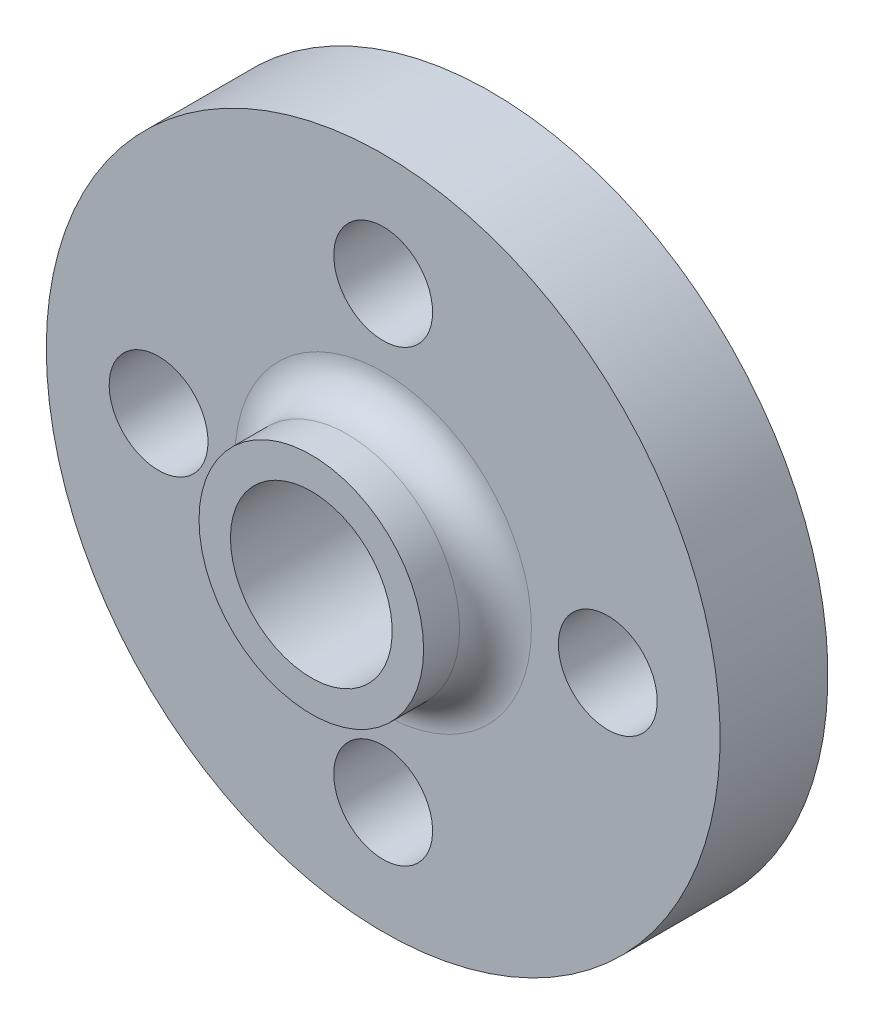
ISO-10303-21;
HEADER;
FILE_DESCRIPTION(('STEP AP214'),'2;1');
FILE_NAME('part.step','',(''),(''),'','','');
FILE_SCHEMA(('AUTOMOTIVE_DESIGN { 1 0 10303 214 1 1 1 1 }'));
ENDSEC;
DATA;
#1=APPLICATION_CONTEXT('core data for automotive mechanical design processes');
#2=APPLICATION_PROTOCOL_DEFINITION('international standard','automotive_design',2000,#1);
#3=PRODUCT_CONTEXT('',#1,'mechanical');
#4=PRODUCT('Part','Part','',(#3));
#5=PRODUCT_RELATED_PRODUCT_CATEGORY('part','',(#4));
#6=PRODUCT_DEFINITION_FORMATION('','',#4);
#7=PRODUCT_DEFINITION_CONTEXT('part definition',#1,'design');
#8=PRODUCT_DEFINITION('design','',#6,#7);
#9=PRODUCT_DEFINITION_SHAPE('','',#8);
#10=(LENGTH_UNIT() NAMED_UNIT(*) SI_UNIT(.MILLI.,.METRE.));
#11=(NAMED_UNIT(*) PLANE_ANGLE_UNIT() SI_UNIT($,.RADIAN.));
#12=(NAMED_UNIT(*) SI_UNIT($,.STERADIAN.) SOLID_ANGLE_UNIT());
#13=UNCERTAINTY_MEASURE_WITH_UNIT(LENGTH_MEASURE(1.E-05),#10,'distance_accuracy_value','');
#14=(GEOMETRIC_REPRESENTATION_CONTEXT(3) GLOBAL_UNCERTAINTY_ASSIGNED_CONTEXT((#13)) GLOBAL_UNIT_ASSIGNED_CONTEXT((#10,
#11,#12)) REPRESENTATION_CONTEXT('',''));
#15=CARTESIAN_POINT('',(0.,0.,0.));
#16=DIRECTION('',(0.,0.,1.));
#17=DIRECTION('',(1.,0.,0.));
#18=AXIS2_PLACEMENT_3D('',#15,#16,#17);
#19=CARTESIAN_POINT('',(0.,0.,16.));
#20=DIRECTION('',(0.,0.,-1.));
#21=DIRECTION('',(-1.,0.,0.));
#22=AXIS2_PLACEMENT_3D('',#19,#20,#21);
#23=TOROIDAL_SURFACE('',#22,16.5,4.);
#24=CARTESIAN_POINT('',(0.,0.,12.));
#25=DIRECTION('',(0.,0.,-1.));
#26=DIRECTION('',(-1.,0.,0.));
#27=AXIS2_PLACEMENT_3D('',#24,#25,#26);
#28=CIRCLE('',#27,16.5);
#29=CARTESIAN_POINT('',(-16.5,0.,12.));
#30=VERTEX_POINT('',#29);
#31=EDGE_CURVE('E117',#30,#30,#28,.T.);
#32=ORIENTED_EDGE('',*,*,#31,.F.);
#33=EDGE_LOOP('',(#32));
#34=FACE_BOUND('',#33,.T.);
#35=CARTESIAN_POINT('',(0.,0.,16.));
#36=DIRECTION('',(0.,0.,1.));
#37=DIRECTION('',(-1.,0.,0.));
#38=AXIS2_PLACEMENT_3D('',#35,#36,#37);
#39=CIRCLE('',#38,12.5);
#40=CARTESIAN_POINT('',(-12.5,0.,16.));
#41=VERTEX_POINT('',#40);
#42=EDGE_CURVE('E127',#41,#41,#39,.T.);
#43=ORIENTED_EDGE('',*,*,#42,.F.);
#44=EDGE_LOOP('',(#43));
#45=FACE_BOUND('',#44,.T.);
#46=ADVANCED_FACE('F17',(#34,#45),#23,.F.);
#47=CARTESIAN_POINT('',(0.,25.,-95.9351657246145));
#48=DIRECTION('',(0.,0.,1.));
#49=DIRECTION('',(1.,0.,0.));
#50=AXIS2_PLACEMENT_3D('',#47,#48,#49);
#51=CYLINDRICAL_SURFACE('',#50,5.5);
#52=CARTESIAN_POINT('',(0.,25.,12.));
#53=DIRECTION('',(0.,0.,-1.));
#54=DIRECTION('',(1.,0.,0.));
#55=AXIS2_PLACEMENT_3D('',#52,#53,#54);
#56=CIRCLE('',#55,5.5);
#57=CARTESIAN_POINT('',(5.5,25.,12.));
#58=VERTEX_POINT('',#57);
#59=EDGE_CURVE('E116',#58,#58,#56,.T.);
#60=ORIENTED_EDGE('',*,*,#59,.F.);
#61=EDGE_LOOP('',(#60));
#62=FACE_BOUND('',#61,.T.);
#63=CARTESIAN_POINT('',(0.,25.,0.));
#64=DIRECTION('',(0.,0.,-1.));
#65=DIRECTION('',(1.,0.,0.));
#66=AXIS2_PLACEMENT_3D('',#63,#64,#65);
#67=CIRCLE('',#66,5.5);
#68=CARTESIAN_POINT('',(5.5,25.,0.));
#69=VERTEX_POINT('',#68);
#70=EDGE_CURVE('E132',#69,#69,#67,.T.);
#71=ORIENTED_EDGE('',*,*,#70,.T.);
#72=EDGE_LOOP('',(#71));
#73=FACE_BOUND('',#72,.T.);
#74=ADVANCED_FACE('F155',(#62,#73),#51,.F.);
#75=CARTESIAN_POINT('',(-9.,0.,20.));
#76=DIRECTION('',(0.,0.,-1.));
#77=DIRECTION('',(0.,-1.,0.));
#78=AXIS2_PLACEMENT_3D('',#75,#76,#77);
#79=PLANE('',#78);
#80=CARTESIAN_POINT('',(0.,0.,20.));
#81=DIRECTION('',(0.,0.,-1.));
#82=DIRECTION('',(-1.,0.,0.));
#83=AXIS2_PLACEMENT_3D('',#80,#81,#82);
#84=CIRCLE('',#83,9.);
#85=CARTESIAN_POINT('',(-9.,0.,20.));
#86=VERTEX_POINT('',#85);
#87=EDGE_CURVE('E11',#86,#86,#84,.T.);
#88=ORIENTED_EDGE('',*,*,#87,.T.);
#89=EDGE_LOOP('',(#88));
#90=FACE_BOUND('',#89,.T.);
#91=CARTESIAN_POINT('',(0.,0.,20.));
#92=DIRECTION('',(0.,0.,-1.));
#93=DIRECTION('',(-1.,0.,0.));
#94=AXIS2_PLACEMENT_3D('',#91,#92,#93);
#95=CIRCLE('',#94,12.5);
#96=CARTESIAN_POINT('',(-12.5,0.,20.));
#97=VERTEX_POINT('',#96);
#98=EDGE_CURVE('E121',#97,#97,#95,.T.);
#99=ORIENTED_EDGE('',*,*,#98,.F.);
#100=EDGE_LOOP('',(#99));
#101=FACE_BOUND('',#100,.T.);
#102=ADVANCED_FACE('F158',(#90,#101),#79,.F.);
#103=CARTESIAN_POINT('',(0.,0.,0.));
#104=DIRECTION('',(0.,0.,-1.));
#105=DIRECTION('',(-1.,0.,0.));
#106=AXIS2_PLACEMENT_3D('',#103,#104,#105);
#107=CYLINDRICAL_SURFACE('',#106,9.);
#108=CARTESIAN_POINT('',(0.,0.,0.));
#109=DIRECTION('',(0.,0.,-1.));
#110=DIRECTION('',(-1.,0.,0.));
#111=AXIS2_PLACEMENT_3D('',#108,#109,#110);
#112=CIRCLE('',#111,9.);
#113=CARTESIAN_POINT('',(-9.,0.,0.));
#114=VERTEX_POINT('',#113);
#115=EDGE_CURVE('E28',#114,#114,#112,.T.);
#116=ORIENTED_EDGE('',*,*,#115,.T.);
#117=EDGE_LOOP('',(#116));
#118=FACE_BOUND('',#117,.T.);
#119=ORIENTED_EDGE('',*,*,#87,.F.);
#120=EDGE_LOOP('',(#119));
#121=FACE_BOUND('',#120,.T.);
#122=ADVANCED_FACE('F166',(#118,#121),#107,.F.);
#123=CARTESIAN_POINT('',(-37.5,0.,0.));
#124=DIRECTION('',(0.,0.,1.));
#125=DIRECTION('',(1.,0.,0.));
#126=AXIS2_PLACEMENT_3D('',#123,#124,#125);
#127=PLANE('',#126);
#128=CARTESIAN_POINT('',(0.,0.,0.));
#129=DIRECTION('',(0.,0.,-1.));
#130=DIRECTION('',(-1.,0.,0.));
#131=AXIS2_PLACEMENT_3D('',#128,#129,#130);
#132=CIRCLE('',#131,37.5);
#133=CARTESIAN_POINT('',(-37.5,0.,0.));
#134=VERTEX_POINT('',#133);
#135=EDGE_CURVE('E135',#134,#134,#132,.T.);
#136=ORIENTED_EDGE('',*,*,#135,.T.);
#137=EDGE_LOOP('',(#136));
#138=FACE_BOUND('',#137,.T.);
#139=ORIENTED_EDGE('',*,*,#115,.F.);
#140=EDGE_LOOP('',(#139));
#141=FACE_BOUND('',#140,.T.);
#142=ORIENTED_EDGE('',*,*,#70,.F.);
#143=EDGE_LOOP('',(#142));
#144=FACE_BOUND('',#143,.T.);
#145=CARTESIAN_POINT('',(25.,0.,0.));
#146=DIRECTION('',(0.,0.,-1.));
#147=DIRECTION('',(0.,-1.,0.));
#148=AXIS2_PLACEMENT_3D('',#145,#146,#147);
#149=CIRCLE('',#148,5.5);
#150=CARTESIAN_POINT('',(25.,-5.5,0.));
#151=VERTEX_POINT('',#150);
#152=EDGE_CURVE('E111',#151,#151,#149,.T.);
#153=ORIENTED_EDGE('',*,*,#152,.F.);
#154=EDGE_LOOP('',(#153));
#155=FACE_BOUND('',#154,.T.);
#156=CARTESIAN_POINT('',(0.,-25.,0.));
#157=DIRECTION('',(0.,0.,-1.));
#158=DIRECTION('',(-1.,0.,0.));
#159=AXIS2_PLACEMENT_3D('',#156,#157,#158);
#160=CIRCLE('',#159,5.5);
#161=CARTESIAN_POINT('',(-5.5,-25.,0.));
#162=VERTEX_POINT('',#161);
#163=EDGE_CURVE('E100',#162,#162,#160,.T.);
#164=ORIENTED_EDGE('',*,*,#163,.F.);
#165=EDGE_LOOP('',(#164));
#166=FACE_BOUND('',#165,.T.);
#167=CARTESIAN_POINT('',(-25.,0.,0.));
#168=DIRECTION('',(0.,0.,-1.));
#169=DIRECTION('',(0.,1.,0.));
#170=AXIS2_PLACEMENT_3D('',#167,#168,#169);
#171=CIRCLE('',#170,5.5);
#172=CARTESIAN_POINT('',(-25.,5.5,0.));
#173=VERTEX_POINT('',#172);
#174=EDGE_CURVE('E87',#173,#173,#171,.T.);
#175=ORIENTED_EDGE('',*,*,#174,.F.);
#176=EDGE_LOOP('',(#175));
#177=FACE_BOUND('',#176,.T.);
#178=ADVANCED_FACE('F162',(#138,#141,#144,#155,#166,#177),#127,.F.);
#179=CARTESIAN_POINT('',(0.,0.,0.));
#180=DIRECTION('',(0.,0.,-1.));
#181=DIRECTION('',(-1.,0.,0.));
#182=AXIS2_PLACEMENT_3D('',#179,#180,#181);
#183=CYLINDRICAL_SURFACE('',#182,37.5);
#184=CARTESIAN_POINT('',(0.,0.,12.));
#185=DIRECTION('',(0.,0.,-1.));
#186=DIRECTION('',(-1.,0.,0.));
#187=AXIS2_PLACEMENT_3D('',#184,#185,#186);
#188=CIRCLE('',#187,37.5);
#189=CARTESIAN_POINT('',(-37.5,0.,12.));
#190=VERTEX_POINT('',#189);
#191=EDGE_CURVE('E21',#190,#190,#188,.T.);
#192=ORIENTED_EDGE('',*,*,#191,.T.);
#193=EDGE_LOOP('',(#192));
#194=FACE_BOUND('',#193,.T.);
#195=ORIENTED_EDGE('',*,*,#135,.F.);
#196=EDGE_LOOP('',(#195));
#197=FACE_BOUND('',#196,.T.);
#198=ADVANCED_FACE('F165',(#194,#197),#183,.T.);
#199=CARTESIAN_POINT('',(-12.5,0.,12.));
#200=DIRECTION('',(0.,0.,-1.));
#201=DIRECTION('',(0.,-1.,0.));
#202=AXIS2_PLACEMENT_3D('',#199,#200,#201);
#203=PLANE('',#202);
#204=ORIENTED_EDGE('',*,*,#191,.F.);
#205=EDGE_LOOP('',(#204));
#206=FACE_BOUND('',#205,.T.);
#207=ORIENTED_EDGE('',*,*,#59,.T.);
#208=EDGE_LOOP('',(#207));
#209=FACE_BOUND('',#208,.T.);
#210=CARTESIAN_POINT('',(25.,0.,12.));
#211=DIRECTION('',(0.,0.,-1.));
#212=DIRECTION('',(0.,-1.,0.));
#213=AXIS2_PLACEMENT_3D('',#210,#211,#212);
#214=CIRCLE('',#213,5.5);
#215=CARTESIAN_POINT('',(25.,-5.5,12.));
#216=VERTEX_POINT('',#215);
#217=EDGE_CURVE('E124',#216,#216,#214,.T.);
#218=ORIENTED_EDGE('',*,*,#217,.T.);
#219=EDGE_LOOP('',(#218));
#220=FACE_BOUND('',#219,.T.);
#221=CARTESIAN_POINT('',(0.,-25.,12.));
#222=DIRECTION('',(0.,0.,-1.));
#223=DIRECTION('',(-1.,0.,0.));
#224=AXIS2_PLACEMENT_3D('',#221,#222,#223);
#225=CIRCLE('',#224,5.5);
#226=CARTESIAN_POINT('',(-5.5,-25.,12.));
#227=VERTEX_POINT('',#226);
#228=EDGE_CURVE('E104',#227,#227,#225,.T.);
#229=ORIENTED_EDGE('',*,*,#228,.T.);
#230=EDGE_LOOP('',(#229));
#231=FACE_BOUND('',#230,.T.);
#232=CARTESIAN_POINT('',(-25.,0.,12.));
#233=DIRECTION('',(0.,0.,-1.));
#234=DIRECTION('',(0.,1.,0.));
#235=AXIS2_PLACEMENT_3D('',#232,#233,#234);
#236=CIRCLE('',#235,5.5);
#237=CARTESIAN_POINT('',(-25.,5.5,12.));
#238=VERTEX_POINT('',#237);
#239=EDGE_CURVE('E92',#238,#238,#236,.T.);
#240=ORIENTED_EDGE('',*,*,#239,.T.);
#241=EDGE_LOOP('',(#240));
#242=FACE_BOUND('',#241,.T.);
#243=ORIENTED_EDGE('',*,*,#31,.T.);
#244=EDGE_LOOP('',(#243));
#245=FACE_BOUND('',#244,.T.);
#246=ADVANCED_FACE('F152',(#206,#209,#220,#231,#242,#245),#203,.F.);
#247=CARTESIAN_POINT('',(0.,0.,0.));
#248=DIRECTION('',(0.,0.,-1.));
#249=DIRECTION('',(-1.,0.,0.));
#250=AXIS2_PLACEMENT_3D('',#247,#248,#249);
#251=CYLINDRICAL_SURFACE('',#250,12.5);
#252=ORIENTED_EDGE('',*,*,#98,.T.);
#253=EDGE_LOOP('',(#252));
#254=FACE_BOUND('',#253,.T.);
#255=ORIENTED_EDGE('',*,*,#42,.T.);
#256=EDGE_LOOP('',(#255));
#257=FACE_BOUND('',#256,.T.);
#258=ADVANCED_FACE('F173',(#254,#257),#251,.T.);
#259=CARTESIAN_POINT('',(25.,0.,-95.9351657246145));
#260=DIRECTION('',(0.,0.,1.));
#261=DIRECTION('',(0.,-1.,0.));
#262=AXIS2_PLACEMENT_3D('',#259,#260,#261);
#263=CYLINDRICAL_SURFACE('',#262,5.5);
#264=ORIENTED_EDGE('',*,*,#217,.F.);
#265=EDGE_LOOP('',(#264));
#266=FACE_BOUND('',#265,.T.);
#267=ORIENTED_EDGE('',*,*,#152,.T.);
#268=EDGE_LOOP('',(#267));
#269=FACE_BOUND('',#268,.T.);
#270=ADVANCED_FACE('F171',(#266,#269),#263,.F.);
#271=CARTESIAN_POINT('',(0.,-25.,-95.9351657246145));
#272=DIRECTION('',(0.,0.,1.));
#273=DIRECTION('',(-1.,0.,0.));
#274=AXIS2_PLACEMENT_3D('',#271,#272,#273);
#275=CYLINDRICAL_SURFACE('',#274,5.5);
#276=ORIENTED_EDGE('',*,*,#228,.F.);
#277=EDGE_LOOP('',(#276));
#278=FACE_BOUND('',#277,.T.);
#279=ORIENTED_EDGE('',*,*,#163,.T.);
#280=EDGE_LOOP('',(#279));
#281=FACE_BOUND('',#280,.T.);
#282=ADVANCED_FACE('F101',(#278,#281),#275,.F.);
#283=CARTESIAN_POINT('',(-25.,0.,-95.9351657246145));
#284=DIRECTION('',(0.,0.,1.));
#285=DIRECTION('',(0.,1.,0.));
#286=AXIS2_PLACEMENT_3D('',#283,#284,#285);
#287=CYLINDRICAL_SURFACE('',#286,5.5);
#288=ORIENTED_EDGE('',*,*,#239,.F.);
#289=EDGE_LOOP('',(#288));
#290=FACE_BOUND('',#289,.T.);
#291=ORIENTED_EDGE('',*,*,#174,.T.);
#292=EDGE_LOOP('',(#291));
#293=FACE_BOUND('',#292,.T.);
#294=ADVANCED_FACE('F19',(#290,#293),#287,.F.);
#295=CLOSED_SHELL('',(#46,#74,#102,#122,#178,#198,#246,#258,#270,#282,#294));
#296=MANIFOLD_SOLID_BREP('B1',#295);
#297=ADVANCED_BREP_SHAPE_REPRESENTATION('',(#18,#296),#14);
#298=SHAPE_DEFINITION_REPRESENTATION(#9,#297);
ENDSEC;
END-ISO-10303-21;
